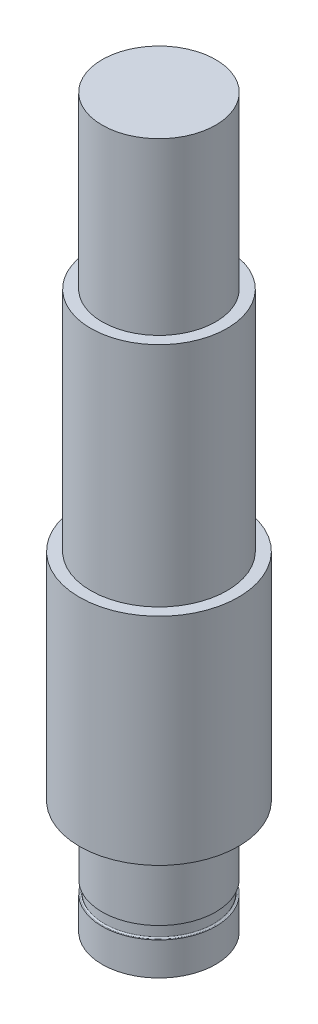
ISO-10303-21;
HEADER;
FILE_DESCRIPTION(('STEP AP214'),'2;1');
FILE_NAME('part.step','',(''),(''),'','','');
FILE_SCHEMA(('AUTOMOTIVE_DESIGN { 1 0 10303 214 1 1 1 1 }'));
ENDSEC;
DATA;
#1=APPLICATION_CONTEXT('core data for automotive mechanical design processes');
#2=APPLICATION_PROTOCOL_DEFINITION('international standard','automotive_design',2000,#1);
#3=PRODUCT_CONTEXT('',#1,'mechanical');
#4=PRODUCT('Part','Part','',(#3));
#5=PRODUCT_RELATED_PRODUCT_CATEGORY('part','',(#4));
#6=PRODUCT_DEFINITION_FORMATION('','',#4);
#7=PRODUCT_DEFINITION_CONTEXT('part definition',#1,'design');
#8=PRODUCT_DEFINITION('design','',#6,#7);
#9=PRODUCT_DEFINITION_SHAPE('','',#8);
#10=(LENGTH_UNIT() NAMED_UNIT(*) SI_UNIT(.MILLI.,.METRE.));
#11=(NAMED_UNIT(*) PLANE_ANGLE_UNIT() SI_UNIT($,.RADIAN.));
#12=(NAMED_UNIT(*) SI_UNIT($,.STERADIAN.) SOLID_ANGLE_UNIT());
#13=UNCERTAINTY_MEASURE_WITH_UNIT(LENGTH_MEASURE(1.E-05),#10,'distance_accuracy_value','');
#14=(GEOMETRIC_REPRESENTATION_CONTEXT(3) GLOBAL_UNCERTAINTY_ASSIGNED_CONTEXT((#13)) GLOBAL_UNIT_ASSIGNED_CONTEXT((#10,
#11,#12)) REPRESENTATION_CONTEXT('',''));
#15=CARTESIAN_POINT('',(0.,0.,0.));
#16=DIRECTION('',(0.,0.,1.));
#17=DIRECTION('',(1.,0.,0.));
#18=AXIS2_PLACEMENT_3D('',#15,#16,#17);
#19=CARTESIAN_POINT('',(0.,64.,0.));
#20=DIRECTION('',(0.,1.,0.));
#21=DIRECTION('',(0.,0.,1.));
#22=AXIS2_PLACEMENT_3D('',#19,#20,#21);
#23=CYLINDRICAL_SURFACE('',#22,4.99999999999999);
#24=CARTESIAN_POINT('',(0.,10.,0.));
#25=DIRECTION('',(0.,1.,0.));
#26=DIRECTION('',(0.,0.,1.));
#27=AXIS2_PLACEMENT_3D('',#24,#25,#26);
#28=CIRCLE('',#27,4.99999999999999);
#29=CARTESIAN_POINT('',(0.,10.,4.99999999999999));
#30=VERTEX_POINT('',#29);
#31=EDGE_CURVE('E46',#30,#30,#28,.T.);
#32=ORIENTED_EDGE('',*,*,#31,.F.);
#33=EDGE_LOOP('',(#32));
#34=FACE_BOUND('',#33,.T.);
#35=CARTESIAN_POINT('',(0.,3.99999999999999,0.));
#36=DIRECTION('',(0.,-1.,0.));
#37=DIRECTION('',(0.,0.,-1.));
#38=AXIS2_PLACEMENT_3D('',#35,#36,#37);
#39=CIRCLE('',#38,4.99999999999999);
#40=CARTESIAN_POINT('',(0.,3.99999999999999,-4.99999999999999));
#41=VERTEX_POINT('',#40);
#42=EDGE_CURVE('E55',#41,#41,#39,.T.);
#43=ORIENTED_EDGE('',*,*,#42,.F.);
#44=EDGE_LOOP('',(#43));
#45=FACE_BOUND('',#44,.T.);
#46=ADVANCED_FACE('F37',(#34,#45),#23,.T.);
#47=CARTESIAN_POINT('',(0.,10.,-4.99999999999999));
#48=DIRECTION('',(0.,1.,0.));
#49=DIRECTION('',(0.,0.,1.));
#50=AXIS2_PLACEMENT_3D('',#47,#48,#49);
#51=PLANE('',#50);
#52=CARTESIAN_POINT('',(0.,10.,0.));
#53=DIRECTION('',(0.,1.,0.));
#54=DIRECTION('',(0.,0.,1.));
#55=AXIS2_PLACEMENT_3D('',#52,#53,#54);
#56=CIRCLE('',#55,6.99999999999999);
#57=CARTESIAN_POINT('',(0.,10.,7.));
#58=VERTEX_POINT('',#57);
#59=EDGE_CURVE('E52',#58,#58,#56,.T.);
#60=ORIENTED_EDGE('',*,*,#59,.F.);
#61=EDGE_LOOP('',(#60));
#62=FACE_BOUND('',#61,.T.);
#63=ORIENTED_EDGE('',*,*,#31,.T.);
#64=EDGE_LOOP('',(#63));
#65=FACE_BOUND('',#64,.T.);
#66=ADVANCED_FACE('F100',(#62,#65),#51,.F.);
#67=CARTESIAN_POINT('',(0.,64.,0.));
#68=DIRECTION('',(0.,1.,0.));
#69=DIRECTION('',(0.,0.,1.));
#70=AXIS2_PLACEMENT_3D('',#67,#68,#69);
#71=CYLINDRICAL_SURFACE('',#70,7.);
#72=CARTESIAN_POINT('',(0.,29.,0.));
#73=DIRECTION('',(0.,1.,0.));
#74=DIRECTION('',(0.,0.,1.));
#75=AXIS2_PLACEMENT_3D('',#72,#73,#74);
#76=CIRCLE('',#75,7.);
#77=CARTESIAN_POINT('',(0.,29.,7.00000000000001));
#78=VERTEX_POINT('',#77);
#79=EDGE_CURVE('E91',#78,#78,#76,.T.);
#80=ORIENTED_EDGE('',*,*,#79,.F.);
#81=EDGE_LOOP('',(#80));
#82=FACE_BOUND('',#81,.T.);
#83=ORIENTED_EDGE('',*,*,#59,.T.);
#84=EDGE_LOOP('',(#83));
#85=FACE_BOUND('',#84,.T.);
#86=ADVANCED_FACE('F98',(#82,#85),#71,.T.);
#87=CARTESIAN_POINT('',(0.,29.,-6.99999999999999));
#88=DIRECTION('',(0.,-1.,0.));
#89=DIRECTION('',(0.,0.,-1.));
#90=AXIS2_PLACEMENT_3D('',#87,#88,#89);
#91=PLANE('',#90);
#92=CARTESIAN_POINT('',(0.,29.,0.));
#93=DIRECTION('',(0.,1.,0.));
#94=DIRECTION('',(0.,0.,1.));
#95=AXIS2_PLACEMENT_3D('',#92,#93,#94);
#96=CIRCLE('',#95,6.);
#97=CARTESIAN_POINT('',(0.,29.,6.));
#98=VERTEX_POINT('',#97);
#99=EDGE_CURVE('E87',#98,#98,#96,.T.);
#100=ORIENTED_EDGE('',*,*,#99,.F.);
#101=EDGE_LOOP('',(#100));
#102=FACE_BOUND('',#101,.T.);
#103=ORIENTED_EDGE('',*,*,#79,.T.);
#104=EDGE_LOOP('',(#103));
#105=FACE_BOUND('',#104,.T.);
#106=ADVANCED_FACE('F149',(#102,#105),#91,.F.);
#107=CARTESIAN_POINT('',(0.,64.,0.));
#108=DIRECTION('',(0.,1.,0.));
#109=DIRECTION('',(0.,0.,1.));
#110=AXIS2_PLACEMENT_3D('',#107,#108,#109);
#111=CYLINDRICAL_SURFACE('',#110,6.);
#112=CARTESIAN_POINT('',(0.,49.,0.));
#113=DIRECTION('',(0.,1.,0.));
#114=DIRECTION('',(0.,0.,1.));
#115=AXIS2_PLACEMENT_3D('',#112,#113,#114);
#116=CIRCLE('',#115,6.);
#117=CARTESIAN_POINT('',(0.,49.,6.00000000000001));
#118=VERTEX_POINT('',#117);
#119=EDGE_CURVE('E83',#118,#118,#116,.T.);
#120=ORIENTED_EDGE('',*,*,#119,.F.);
#121=EDGE_LOOP('',(#120));
#122=FACE_BOUND('',#121,.T.);
#123=ORIENTED_EDGE('',*,*,#99,.T.);
#124=EDGE_LOOP('',(#123));
#125=FACE_BOUND('',#124,.T.);
#126=ADVANCED_FACE('F145',(#122,#125),#111,.T.);
#127=CARTESIAN_POINT('',(0.,49.,-5.99999999999999));
#128=DIRECTION('',(0.,-1.,0.));
#129=DIRECTION('',(0.,0.,-1.));
#130=AXIS2_PLACEMENT_3D('',#127,#128,#129);
#131=PLANE('',#130);
#132=CARTESIAN_POINT('',(0.,49.,0.));
#133=DIRECTION('',(0.,1.,0.));
#134=DIRECTION('',(0.,0.,1.));
#135=AXIS2_PLACEMENT_3D('',#132,#133,#134);
#136=CIRCLE('',#135,5.);
#137=CARTESIAN_POINT('',(0.,49.,5.00000000000001));
#138=VERTEX_POINT('',#137);
#139=EDGE_CURVE('E79',#138,#138,#136,.T.);
#140=ORIENTED_EDGE('',*,*,#139,.F.);
#141=EDGE_LOOP('',(#140));
#142=FACE_BOUND('',#141,.T.);
#143=ORIENTED_EDGE('',*,*,#119,.T.);
#144=EDGE_LOOP('',(#143));
#145=FACE_BOUND('',#144,.T.);
#146=ADVANCED_FACE('F141',(#142,#145),#131,.F.);
#147=CARTESIAN_POINT('',(0.,64.,0.));
#148=DIRECTION('',(0.,1.,0.));
#149=DIRECTION('',(0.,0.,1.));
#150=AXIS2_PLACEMENT_3D('',#147,#148,#149);
#151=CYLINDRICAL_SURFACE('',#150,5.);
#152=CARTESIAN_POINT('',(0.,64.,0.));
#153=DIRECTION('',(0.,1.,0.));
#154=DIRECTION('',(0.,0.,1.));
#155=AXIS2_PLACEMENT_3D('',#152,#153,#154);
#156=CIRCLE('',#155,5.);
#157=CARTESIAN_POINT('',(0.,64.,5.00000000000002));
#158=VERTEX_POINT('',#157);
#159=EDGE_CURVE('E64',#158,#158,#156,.T.);
#160=ORIENTED_EDGE('',*,*,#159,.F.);
#161=EDGE_LOOP('',(#160));
#162=FACE_BOUND('',#161,.T.);
#163=ORIENTED_EDGE('',*,*,#139,.T.);
#164=EDGE_LOOP('',(#163));
#165=FACE_BOUND('',#164,.T.);
#166=ADVANCED_FACE('F133',(#162,#165),#151,.T.);
#167=CARTESIAN_POINT('',(0.,64.,-4.99999999999999));
#168=DIRECTION('',(0.,-1.,0.));
#169=DIRECTION('',(0.,0.,-1.));
#170=AXIS2_PLACEMENT_3D('',#167,#168,#169);
#171=PLANE('',#170);
#172=ORIENTED_EDGE('',*,*,#159,.T.);
#173=EDGE_LOOP('',(#172));
#174=FACE_BOUND('',#173,.T.);
#175=ADVANCED_FACE('F123',(#174),#171,.F.);
#176=CARTESIAN_POINT('',(0.,2.89999999999999,4.91));
#177=DIRECTION('',(0.,1.,0.));
#178=DIRECTION('',(0.,0.,1.));
#179=AXIS2_PLACEMENT_3D('',#176,#177,#178);
#180=PLANE('',#179);
#181=CARTESIAN_POINT('',(0.,2.89999999999999,0.));
#182=DIRECTION('',(0.,1.,0.));
#183=DIRECTION('',(0.,0.,1.));
#184=AXIS2_PLACEMENT_3D('',#181,#182,#183);
#185=CIRCLE('',#184,4.91);
#186=CARTESIAN_POINT('',(0.,2.89999999999999,4.91));
#187=VERTEX_POINT('',#186);
#188=EDGE_CURVE('E58',#187,#187,#185,.T.);
#189=ORIENTED_EDGE('',*,*,#188,.F.);
#190=EDGE_LOOP('',(#189));
#191=FACE_BOUND('',#190,.T.);
#192=CARTESIAN_POINT('',(0.,2.89999999999999,0.));
#193=DIRECTION('',(0.,1.,0.));
#194=DIRECTION('',(0.,0.,1.));
#195=AXIS2_PLACEMENT_3D('',#192,#193,#194);
#196=CIRCLE('',#195,4.99999999999999);
#197=CARTESIAN_POINT('',(0.,2.89999999999999,4.99999999999999));
#198=VERTEX_POINT('',#197);
#199=EDGE_CURVE('E41',#198,#198,#196,.T.);
#200=ORIENTED_EDGE('',*,*,#199,.T.);
#201=EDGE_LOOP('',(#200));
#202=FACE_BOUND('',#201,.T.);
#203=ADVANCED_FACE('F120',(#191,#202),#180,.T.);
#204=CARTESIAN_POINT('',(0.,3.99999999999999,5.99999999999998));
#205=DIRECTION('',(0.,-1.,0.));
#206=DIRECTION('',(0.,0.,-1.));
#207=AXIS2_PLACEMENT_3D('',#204,#205,#206);
#208=PLANE('',#207);
#209=CARTESIAN_POINT('',(0.,3.99999999999999,0.));
#210=DIRECTION('',(0.,1.,0.));
#211=DIRECTION('',(0.,0.,1.));
#212=AXIS2_PLACEMENT_3D('',#209,#210,#211);
#213=CIRCLE('',#212,4.91);
#214=CARTESIAN_POINT('',(0.,3.99999999999999,4.91));
#215=VERTEX_POINT('',#214);
#216=EDGE_CURVE('E254',#215,#215,#213,.T.);
#217=ORIENTED_EDGE('',*,*,#216,.T.);
#218=EDGE_LOOP('',(#217));
#219=FACE_BOUND('',#218,.T.);
#220=ORIENTED_EDGE('',*,*,#42,.T.);
#221=EDGE_LOOP('',(#220));
#222=FACE_BOUND('',#221,.T.);
#223=ADVANCED_FACE('F122',(#219,#222),#208,.T.);
#224=CARTESIAN_POINT('',(0.,3.00999999999998,0.));
#225=DIRECTION('',(0.,1.,0.));
#226=DIRECTION('',(0.,0.,1.));
#227=AXIS2_PLACEMENT_3D('',#224,#225,#226);
#228=TOROIDAL_SURFACE('',#227,4.91,0.109999999999999);
#229=ORIENTED_EDGE('',*,*,#188,.T.);
#230=EDGE_LOOP('',(#229));
#231=FACE_BOUND('',#230,.T.);
#232=CARTESIAN_POINT('',(0.,3.00999999999998,0.));
#233=DIRECTION('',(0.,1.,0.));
#234=DIRECTION('',(0.,0.,1.));
#235=AXIS2_PLACEMENT_3D('',#232,#233,#234);
#236=CIRCLE('',#235,4.8);
#237=CARTESIAN_POINT('',(0.,3.00999999999998,4.8));
#238=VERTEX_POINT('',#237);
#239=EDGE_CURVE('E66',#238,#238,#236,.T.);
#240=ORIENTED_EDGE('',*,*,#239,.F.);
#241=EDGE_LOOP('',(#240));
#242=FACE_BOUND('',#241,.T.);
#243=ADVANCED_FACE('F130',(#231,#242),#228,.F.);
#244=CARTESIAN_POINT('',(0.,70.,0.));
#245=DIRECTION('',(0.,1.,0.));
#246=DIRECTION('',(0.,0.,1.));
#247=AXIS2_PLACEMENT_3D('',#244,#245,#246);
#248=CYLINDRICAL_SURFACE('',#247,4.8);
#249=ORIENTED_EDGE('',*,*,#239,.T.);
#250=EDGE_LOOP('',(#249));
#251=FACE_BOUND('',#250,.T.);
#252=CARTESIAN_POINT('',(0.,3.88999999999999,0.));
#253=DIRECTION('',(0.,1.,0.));
#254=DIRECTION('',(0.,0.,1.));
#255=AXIS2_PLACEMENT_3D('',#252,#253,#254);
#256=CIRCLE('',#255,4.8);
#257=CARTESIAN_POINT('',(0.,3.88999999999999,4.8));
#258=VERTEX_POINT('',#257);
#259=EDGE_CURVE('E72',#258,#258,#256,.T.);
#260=ORIENTED_EDGE('',*,*,#259,.F.);
#261=EDGE_LOOP('',(#260));
#262=FACE_BOUND('',#261,.T.);
#263=ADVANCED_FACE('F206',(#251,#262),#248,.T.);
#264=CARTESIAN_POINT('',(0.,3.88999999999999,0.));
#265=DIRECTION('',(0.,1.,0.));
#266=DIRECTION('',(0.,0.,1.));
#267=AXIS2_PLACEMENT_3D('',#264,#265,#266);
#268=TOROIDAL_SURFACE('',#267,4.91,0.109999999999999);
#269=ORIENTED_EDGE('',*,*,#259,.T.);
#270=EDGE_LOOP('',(#269));
#271=FACE_BOUND('',#270,.T.);
#272=ORIENTED_EDGE('',*,*,#216,.F.);
#273=EDGE_LOOP('',(#272));
#274=FACE_BOUND('',#273,.T.);
#275=ADVANCED_FACE('F115',(#271,#274),#268,.F.);
#276=CARTESIAN_POINT('',(0.,0.,0.));
#277=DIRECTION('',(0.,1.,0.));
#278=DIRECTION('',(0.,0.,1.));
#279=AXIS2_PLACEMENT_3D('',#276,#277,#278);
#280=PLANE('',#279);
#281=CARTESIAN_POINT('',(0.,0.,0.));
#282=DIRECTION('',(0.,1.,0.));
#283=DIRECTION('',(0.,0.,1.));
#284=AXIS2_PLACEMENT_3D('',#281,#282,#283);
#285=CIRCLE('',#284,4.99999999999999);
#286=CARTESIAN_POINT('',(0.,0.,4.99999999999999));
#287=VERTEX_POINT('',#286);
#288=EDGE_CURVE('E10',#287,#287,#285,.T.);
#289=ORIENTED_EDGE('',*,*,#288,.F.);
#290=EDGE_LOOP('',(#289));
#291=FACE_BOUND('',#290,.T.);
#292=ADVANCED_FACE('F39',(#291),#280,.F.);
#293=ORIENTED_EDGE('',*,*,#288,.T.);
#294=EDGE_LOOP('',(#293));
#295=FACE_BOUND('',#294,.T.);
#296=ORIENTED_EDGE('',*,*,#199,.F.);
#297=EDGE_LOOP('',(#296));
#298=FACE_BOUND('',#297,.T.);
#299=ADVANCED_FACE('F108',(#295,#298),#23,.T.);
#300=CLOSED_SHELL('',(#46,#66,#86,#106,#126,#146,#166,#175,#203,#223,#243,#263,#275,#292,#299));
#301=MANIFOLD_SOLID_BREP('B2',#300);
#302=ADVANCED_BREP_SHAPE_REPRESENTATION('',(#18,#301),#14);
#303=SHAPE_DEFINITION_REPRESENTATION(#9,#302);
ENDSEC;
END-ISO-10303-21;
